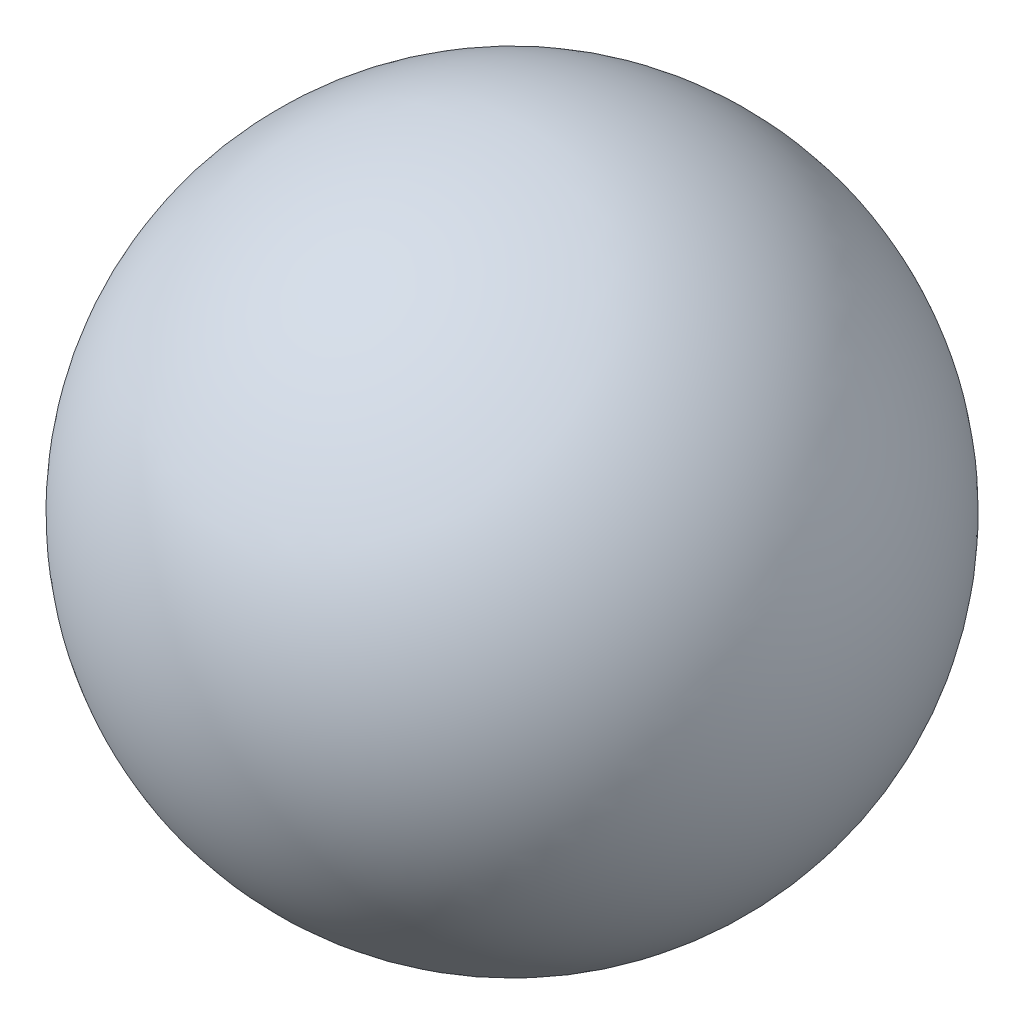
ISO-10303-21;
HEADER;
FILE_DESCRIPTION(('STEP AP214'),'2;1');
FILE_NAME('part.step','',(''),(''),'','','');
FILE_SCHEMA(('AUTOMOTIVE_DESIGN { 1 0 10303 214 1 1 1 1 }'));
ENDSEC;
DATA;
#1=APPLICATION_CONTEXT('core data for automotive mechanical design processes');
#2=APPLICATION_PROTOCOL_DEFINITION('international standard','automotive_design',2000,#1);
#3=PRODUCT_CONTEXT('',#1,'mechanical');
#4=PRODUCT('Part','Part','',(#3));
#5=PRODUCT_RELATED_PRODUCT_CATEGORY('part','',(#4));
#6=PRODUCT_DEFINITION_FORMATION('','',#4);
#7=PRODUCT_DEFINITION_CONTEXT('part definition',#1,'design');
#8=PRODUCT_DEFINITION('design','',#6,#7);
#9=PRODUCT_DEFINITION_SHAPE('','',#8);
#10=(LENGTH_UNIT() NAMED_UNIT(*) SI_UNIT(.MILLI.,.METRE.));
#11=(NAMED_UNIT(*) PLANE_ANGLE_UNIT() SI_UNIT($,.RADIAN.));
#12=(NAMED_UNIT(*) SI_UNIT($,.STERADIAN.) SOLID_ANGLE_UNIT());
#13=UNCERTAINTY_MEASURE_WITH_UNIT(LENGTH_MEASURE(1.E-05),#10,'distance_accuracy_value','');
#14=(GEOMETRIC_REPRESENTATION_CONTEXT(3) GLOBAL_UNCERTAINTY_ASSIGNED_CONTEXT((#13)) GLOBAL_UNIT_ASSIGNED_CONTEXT((#10,
#11,#12)) REPRESENTATION_CONTEXT('',''));
#15=CARTESIAN_POINT('',(0.,0.,0.));
#16=DIRECTION('',(0.,0.,1.));
#17=DIRECTION('',(1.,0.,0.));
#18=AXIS2_PLACEMENT_3D('',#15,#16,#17);
#19=CARTESIAN_POINT('',(0.,0.,0.));
#20=DIRECTION('',(0.,0.,1.));
#21=DIRECTION('',(-1.,0.,0.));
#22=AXIS2_PLACEMENT_3D('',#19,#20,#21);
#23=SPHERICAL_SURFACE('',#22,15.);
#24=CARTESIAN_POINT('',(0.,0.,15.));
#25=VERTEX_POINT('',#24);
#26=VERTEX_LOOP('',#25);
#27=FACE_BOUND('',#26,.T.);
#28=ADVANCED_FACE('F39',(#27),#23,.T.);
#29=CLOSED_SHELL('',(#28));
#30=MANIFOLD_SOLID_BREP('B2',#29);
#31=ADVANCED_BREP_SHAPE_REPRESENTATION('',(#18,#30),#14);
#32=SHAPE_DEFINITION_REPRESENTATION(#9,#31);
ENDSEC;
END-ISO-10303-21;
